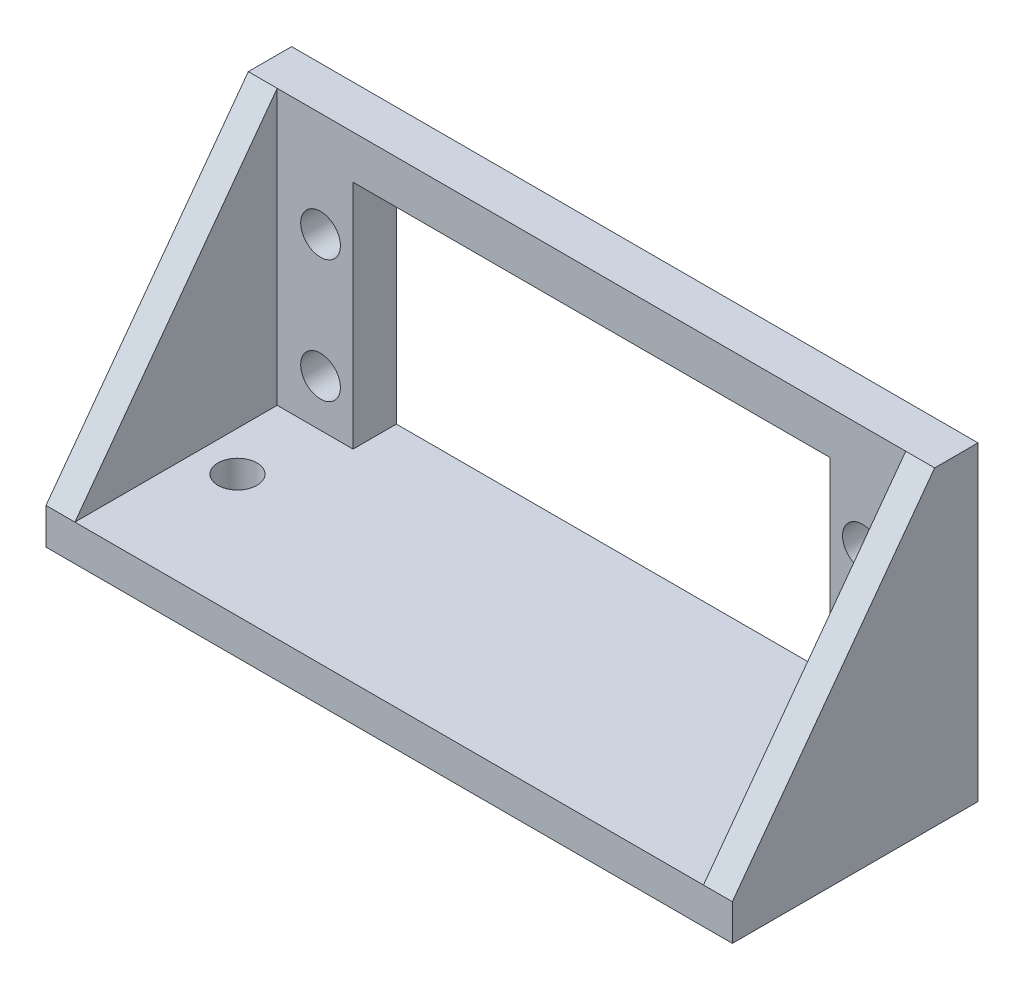
ISO-10303-21;
HEADER;
FILE_DESCRIPTION(('STEP AP214'),'2;1');
FILE_NAME('part.step','',(''),(''),'','','');
FILE_SCHEMA(('AUTOMOTIVE_DESIGN { 1 0 10303 214 1 1 1 1 }'));
ENDSEC;
DATA;
#1=APPLICATION_CONTEXT('core data for automotive mechanical design processes');
#2=APPLICATION_PROTOCOL_DEFINITION('international standard','automotive_design',2000,#1);
#3=PRODUCT_CONTEXT('',#1,'mechanical');
#4=PRODUCT('Part','Part','',(#3));
#5=PRODUCT_RELATED_PRODUCT_CATEGORY('part','',(#4));
#6=PRODUCT_DEFINITION_FORMATION('','',#4);
#7=PRODUCT_DEFINITION_CONTEXT('part definition',#1,'design');
#8=PRODUCT_DEFINITION('design','',#6,#7);
#9=PRODUCT_DEFINITION_SHAPE('','',#8);
#10=(LENGTH_UNIT() NAMED_UNIT(*) SI_UNIT(.MILLI.,.METRE.));
#11=(NAMED_UNIT(*) PLANE_ANGLE_UNIT() SI_UNIT($,.RADIAN.));
#12=(NAMED_UNIT(*) SI_UNIT($,.STERADIAN.) SOLID_ANGLE_UNIT());
#13=UNCERTAINTY_MEASURE_WITH_UNIT(LENGTH_MEASURE(1.E-05),#10,'distance_accuracy_value','');
#14=(GEOMETRIC_REPRESENTATION_CONTEXT(3) GLOBAL_UNCERTAINTY_ASSIGNED_CONTEXT((#13)) GLOBAL_UNIT_ASSIGNED_CONTEXT((#10,
#11,#12)) REPRESENTATION_CONTEXT('',''));
#15=CARTESIAN_POINT('',(0.,0.,0.));
#16=DIRECTION('',(0.,0.,1.));
#17=DIRECTION('',(1.,0.,0.));
#18=AXIS2_PLACEMENT_3D('',#15,#16,#17);
#19=CARTESIAN_POINT('',(-33.,43.,-17.));
#20=DIRECTION('',(-1.,0.,0.));
#21=DIRECTION('',(0.,0.,1.));
#22=AXIS2_PLACEMENT_3D('',#19,#20,#21);
#23=PLANE('',#22);
#24=DIRECTION('',(0.,0.,-1.));
#25=VECTOR('',#24,1.);
#26=CARTESIAN_POINT('',(-33.,37.,-17.));
#27=LINE('',#26,#25);
#28=CARTESIAN_POINT('',(-33.,37.,-11.));
#29=VERTEX_POINT('',#28);
#30=CARTESIAN_POINT('',(-33.,37.,-17.));
#31=VERTEX_POINT('',#30);
#32=EDGE_CURVE('E157',#29,#31,#27,.T.);
#33=ORIENTED_EDGE('',*,*,#32,.F.);
#34=DIRECTION('',(0.,-1.,0.));
#35=VECTOR('',#34,1.);
#36=CARTESIAN_POINT('',(-33.,43.,-11.));
#37=LINE('',#36,#35);
#38=CARTESIAN_POINT('',(-33.,5.,-11.));
#39=VERTEX_POINT('',#38);
#40=EDGE_CURVE('E174',#29,#39,#37,.T.);
#41=ORIENTED_EDGE('',*,*,#40,.T.);
#42=DIRECTION('',(0.,0.,-1.));
#43=VECTOR('',#42,1.);
#44=CARTESIAN_POINT('',(-33.,5.,-17.));
#45=LINE('',#44,#43);
#46=CARTESIAN_POINT('',(-33.,5.,-17.));
#47=VERTEX_POINT('',#46);
#48=EDGE_CURVE('E162',#39,#47,#45,.T.);
#49=ORIENTED_EDGE('',*,*,#48,.T.);
#50=DIRECTION('',(0.,-1.,0.));
#51=VECTOR('',#50,1.);
#52=CARTESIAN_POINT('',(-33.,43.,-17.));
#53=LINE('',#52,#51);
#54=EDGE_CURVE('E180',#31,#47,#53,.T.);
#55=ORIENTED_EDGE('',*,*,#54,.F.);
#56=EDGE_LOOP('',(#33,#41,#49,#55));
#57=FACE_BOUND('',#56,.T.);
#58=ADVANCED_FACE('F35',(#57),#23,.F.);
#59=CARTESIAN_POINT('',(33.,43.,-16.9999999999999));
#60=DIRECTION('',(1.,0.,0.));
#61=DIRECTION('',(0.,0.,-1.));
#62=AXIS2_PLACEMENT_3D('',#59,#60,#61);
#63=PLANE('',#62);
#64=DIRECTION('',(0.,0.,1.));
#65=VECTOR('',#64,1.);
#66=CARTESIAN_POINT('',(33.,37.,-16.9999999999999));
#67=LINE('',#66,#65);
#68=CARTESIAN_POINT('',(33.,37.,-17.));
#69=VERTEX_POINT('',#68);
#70=CARTESIAN_POINT('',(33.,37.,-11.));
#71=VERTEX_POINT('',#70);
#72=EDGE_CURVE('E249',#69,#71,#67,.T.);
#73=ORIENTED_EDGE('',*,*,#72,.F.);
#74=DIRECTION('',(0.,-1.,0.));
#75=VECTOR('',#74,1.);
#76=CARTESIAN_POINT('',(33.,43.,-16.9999999999999));
#77=LINE('',#76,#75);
#78=CARTESIAN_POINT('',(33.,5.,-16.9999999999999));
#79=VERTEX_POINT('',#78);
#80=EDGE_CURVE('E155',#69,#79,#77,.T.);
#81=ORIENTED_EDGE('',*,*,#80,.T.);
#82=DIRECTION('',(0.,0.,1.));
#83=VECTOR('',#82,1.);
#84=CARTESIAN_POINT('',(33.,5.,-16.9999999999999));
#85=LINE('',#84,#83);
#86=CARTESIAN_POINT('',(33.,5.,-10.9999999999999));
#87=VERTEX_POINT('',#86);
#88=EDGE_CURVE('E152',#79,#87,#85,.T.);
#89=ORIENTED_EDGE('',*,*,#88,.T.);
#90=DIRECTION('',(0.,-1.,0.));
#91=VECTOR('',#90,1.);
#92=CARTESIAN_POINT('',(33.,43.,-10.9999999999999));
#93=LINE('',#92,#91);
#94=EDGE_CURVE('E60',#71,#87,#93,.T.);
#95=ORIENTED_EDGE('',*,*,#94,.F.);
#96=EDGE_LOOP('',(#73,#81,#89,#95));
#97=FACE_BOUND('',#96,.T.);
#98=ADVANCED_FACE('F266',(#97),#63,.F.);
#99=CARTESIAN_POINT('',(0.,5.,0.));
#100=DIRECTION('',(0.,1.,0.));
#101=DIRECTION('',(0.,0.,1.));
#102=AXIS2_PLACEMENT_3D('',#99,#100,#101);
#103=PLANE('',#102);
#104=DIRECTION('',(0.,0.,1.));
#105=VECTOR('',#104,1.);
#106=CARTESIAN_POINT('',(43.5,5.,-11.));
#107=LINE('',#106,#105);
#108=CARTESIAN_POINT('',(43.5,5.,-11.));
#109=VERTEX_POINT('',#108);
#110=CARTESIAN_POINT('',(43.5,5.,17.));
#111=VERTEX_POINT('',#110);
#112=EDGE_CURVE('E131',#109,#111,#107,.T.);
#113=ORIENTED_EDGE('',*,*,#112,.F.);
#114=DIRECTION('',(1.,0.,0.));
#115=VECTOR('',#114,1.);
#116=CARTESIAN_POINT('',(33.,5.,-10.9999999999999));
#117=LINE('',#116,#115);
#118=EDGE_CURVE('E143',#87,#109,#117,.T.);
#119=ORIENTED_EDGE('',*,*,#118,.F.);
#120=ORIENTED_EDGE('',*,*,#88,.F.);
#121=DIRECTION('',(-1.,0.,0.));
#122=VECTOR('',#121,1.);
#123=CARTESIAN_POINT('',(-47.5,5.,-17.));
#124=LINE('',#123,#122);
#125=EDGE_CURVE('E183',#79,#47,#124,.T.);
#126=ORIENTED_EDGE('',*,*,#125,.T.);
#127=ORIENTED_EDGE('',*,*,#48,.F.);
#128=DIRECTION('',(1.,0.,0.));
#129=VECTOR('',#128,1.);
#130=CARTESIAN_POINT('',(-33.,5.,-11.));
#131=LINE('',#130,#129);
#132=CARTESIAN_POINT('',(-43.5,5.,-11.));
#133=VERTEX_POINT('',#132);
#134=EDGE_CURVE('E167',#133,#39,#131,.T.);
#135=ORIENTED_EDGE('',*,*,#134,.F.);
#136=DIRECTION('',(0.,0.,1.));
#137=VECTOR('',#136,1.);
#138=CARTESIAN_POINT('',(-43.5,5.,-11.));
#139=LINE('',#138,#137);
#140=CARTESIAN_POINT('',(-43.5,5.,17.));
#141=VERTEX_POINT('',#140);
#142=EDGE_CURVE('E268',#133,#141,#139,.T.);
#143=ORIENTED_EDGE('',*,*,#142,.T.);
#144=DIRECTION('',(1.,0.,0.));
#145=VECTOR('',#144,1.);
#146=CARTESIAN_POINT('',(-47.5,5.,17.));
#147=LINE('',#146,#145);
#148=EDGE_CURVE('E147',#141,#111,#147,.T.);
#149=ORIENTED_EDGE('',*,*,#148,.T.);
#150=EDGE_LOOP('',(#113,#119,#120,#126,#127,#135,#143,#149));
#151=FACE_BOUND('',#150,.T.);
#152=CARTESIAN_POINT('',(-38.,5.,0.));
#153=DIRECTION('',(0.,1.,0.));
#154=DIRECTION('',(0.,0.,1.));
#155=AXIS2_PLACEMENT_3D('',#152,#153,#154);
#156=CIRCLE('',#155,2.7);
#157=CARTESIAN_POINT('',(-38.,5.,2.7));
#158=VERTEX_POINT('',#157);
#159=EDGE_CURVE('E205',#158,#158,#156,.T.);
#160=ORIENTED_EDGE('',*,*,#159,.F.);
#161=EDGE_LOOP('',(#160));
#162=FACE_BOUND('',#161,.T.);
#163=CARTESIAN_POINT('',(38.,5.,0.));
#164=DIRECTION('',(0.,1.,0.));
#165=DIRECTION('',(0.,0.,-1.));
#166=AXIS2_PLACEMENT_3D('',#163,#164,#165);
#167=CIRCLE('',#166,2.7);
#168=CARTESIAN_POINT('',(38.,5.,-2.7));
#169=VERTEX_POINT('',#168);
#170=EDGE_CURVE('E211',#169,#169,#167,.T.);
#171=ORIENTED_EDGE('',*,*,#170,.F.);
#172=EDGE_LOOP('',(#171));
#173=FACE_BOUND('',#172,.T.);
#174=ADVANCED_FACE('F140',(#151,#162,#173),#103,.T.);
#175=CARTESIAN_POINT('',(47.5,5.,-17.));
#176=DIRECTION('',(-1.,0.,0.));
#177=DIRECTION('',(0.,0.,1.));
#178=AXIS2_PLACEMENT_3D('',#175,#176,#177);
#179=PLANE('',#178);
#180=DIRECTION('',(0.,0.,-1.));
#181=VECTOR('',#180,1.);
#182=CARTESIAN_POINT('',(47.5,43.,-17.));
#183=LINE('',#182,#181);
#184=CARTESIAN_POINT('',(47.5,43.,-11.));
#185=VERTEX_POINT('',#184);
#186=CARTESIAN_POINT('',(47.5,43.,-17.));
#187=VERTEX_POINT('',#186);
#188=EDGE_CURVE('E151',#185,#187,#183,.T.);
#189=ORIENTED_EDGE('',*,*,#188,.F.);
#190=DIRECTION('',(0.,0.805055837353368,-0.59319903804985));
#191=VECTOR('',#190,1.);
#192=CARTESIAN_POINT('',(47.5,5.,17.));
#193=LINE('',#192,#191);
#194=CARTESIAN_POINT('',(47.5,5.,17.));
#195=VERTEX_POINT('',#194);
#196=EDGE_CURVE('E148',#195,#185,#193,.T.);
#197=ORIENTED_EDGE('',*,*,#196,.F.);
#198=DIRECTION('',(0.,-1.,0.));
#199=VECTOR('',#198,1.);
#200=CARTESIAN_POINT('',(47.5,5.,17.));
#201=LINE('',#200,#199);
#202=CARTESIAN_POINT('',(47.5,0.,17.));
#203=VERTEX_POINT('',#202);
#204=EDGE_CURVE('E189',#195,#203,#201,.T.);
#205=ORIENTED_EDGE('',*,*,#204,.T.);
#206=DIRECTION('',(0.,0.,-1.));
#207=VECTOR('',#206,1.);
#208=CARTESIAN_POINT('',(47.5,0.,-17.));
#209=LINE('',#208,#207);
#210=CARTESIAN_POINT('',(47.5,0.,-17.));
#211=VERTEX_POINT('',#210);
#212=EDGE_CURVE('E182',#203,#211,#209,.T.);
#213=ORIENTED_EDGE('',*,*,#212,.T.);
#214=DIRECTION('',(0.,-1.,0.));
#215=VECTOR('',#214,1.);
#216=CARTESIAN_POINT('',(47.5,5.,-17.));
#217=LINE('',#216,#215);
#218=EDGE_CURVE('E11',#187,#211,#217,.T.);
#219=ORIENTED_EDGE('',*,*,#218,.F.);
#220=EDGE_LOOP('',(#189,#197,#205,#213,#219));
#221=FACE_BOUND('',#220,.T.);
#222=ADVANCED_FACE('F37',(#221),#179,.F.);
#223=CARTESIAN_POINT('',(-47.5,5.,-17.));
#224=DIRECTION('',(0.,0.,1.));
#225=DIRECTION('',(1.,0.,0.));
#226=AXIS2_PLACEMENT_3D('',#223,#224,#225);
#227=PLANE('',#226);
#228=CARTESIAN_POINT('',(37.5,11.5,-17.));
#229=DIRECTION('',(0.,0.,-1.));
#230=DIRECTION('',(1.,0.,0.));
#231=AXIS2_PLACEMENT_3D('',#228,#229,#230);
#232=CIRCLE('',#231,2.75);
#233=CARTESIAN_POINT('',(40.25,11.5,-17.));
#234=VERTEX_POINT('',#233);
#235=EDGE_CURVE('E209',#234,#234,#232,.T.);
#236=ORIENTED_EDGE('',*,*,#235,.F.);
#237=EDGE_LOOP('',(#236));
#238=FACE_BOUND('',#237,.T.);
#239=CARTESIAN_POINT('',(37.5,28.5,-17.));
#240=DIRECTION('',(0.,0.,-1.));
#241=DIRECTION('',(1.,0.,0.));
#242=AXIS2_PLACEMENT_3D('',#239,#240,#241);
#243=CIRCLE('',#242,2.75);
#244=CARTESIAN_POINT('',(40.25,28.5,-17.));
#245=VERTEX_POINT('',#244);
#246=EDGE_CURVE('E231',#245,#245,#243,.T.);
#247=ORIENTED_EDGE('',*,*,#246,.F.);
#248=EDGE_LOOP('',(#247));
#249=FACE_BOUND('',#248,.T.);
#250=CARTESIAN_POINT('',(-37.5,28.5,-17.));
#251=DIRECTION('',(0.,0.,-1.));
#252=DIRECTION('',(-1.,0.,0.));
#253=AXIS2_PLACEMENT_3D('',#250,#251,#252);
#254=CIRCLE('',#253,2.75);
#255=CARTESIAN_POINT('',(-40.25,28.5,-17.));
#256=VERTEX_POINT('',#255);
#257=EDGE_CURVE('E225',#256,#256,#254,.T.);
#258=ORIENTED_EDGE('',*,*,#257,.F.);
#259=EDGE_LOOP('',(#258));
#260=FACE_BOUND('',#259,.T.);
#261=CARTESIAN_POINT('',(-37.5,11.5,-17.));
#262=DIRECTION('',(0.,0.,-1.));
#263=DIRECTION('',(-1.,0.,0.));
#264=AXIS2_PLACEMENT_3D('',#261,#262,#263);
#265=CIRCLE('',#264,2.75);
#266=CARTESIAN_POINT('',(-40.25,11.5,-17.));
#267=VERTEX_POINT('',#266);
#268=EDGE_CURVE('E224',#267,#267,#265,.T.);
#269=ORIENTED_EDGE('',*,*,#268,.F.);
#270=EDGE_LOOP('',(#269));
#271=FACE_BOUND('',#270,.T.);
#272=ORIENTED_EDGE('',*,*,#80,.F.);
#273=DIRECTION('',(-1.,0.,0.));
#274=VECTOR('',#273,1.);
#275=CARTESIAN_POINT('',(-47.5,37.,-17.));
#276=LINE('',#275,#274);
#277=EDGE_CURVE('E246',#69,#31,#276,.T.);
#278=ORIENTED_EDGE('',*,*,#277,.T.);
#279=ORIENTED_EDGE('',*,*,#54,.T.);
#280=ORIENTED_EDGE('',*,*,#125,.F.);
#281=EDGE_LOOP('',(#272,#278,#279,#280));
#282=FACE_BOUND('',#281,.T.);
#283=DIRECTION('',(-1.,0.,0.));
#284=VECTOR('',#283,1.);
#285=CARTESIAN_POINT('',(-33.,43.,-17.));
#286=LINE('',#285,#284);
#287=CARTESIAN_POINT('',(-47.5,43.,-17.));
#288=VERTEX_POINT('',#287);
#289=EDGE_CURVE('E163',#187,#288,#286,.T.);
#290=ORIENTED_EDGE('',*,*,#289,.F.);
#291=ORIENTED_EDGE('',*,*,#218,.T.);
#292=DIRECTION('',(-1.,0.,0.));
#293=VECTOR('',#292,1.);
#294=CARTESIAN_POINT('',(-47.5,0.,-17.));
#295=LINE('',#294,#293);
#296=CARTESIAN_POINT('',(-47.5,0.,-17.));
#297=VERTEX_POINT('',#296);
#298=EDGE_CURVE('E192',#211,#297,#295,.T.);
#299=ORIENTED_EDGE('',*,*,#298,.T.);
#300=DIRECTION('',(0.,-1.,0.));
#301=VECTOR('',#300,1.);
#302=CARTESIAN_POINT('',(-47.5,5.,-17.));
#303=LINE('',#302,#301);
#304=EDGE_CURVE('E44',#288,#297,#303,.T.);
#305=ORIENTED_EDGE('',*,*,#304,.F.);
#306=EDGE_LOOP('',(#290,#291,#299,#305));
#307=FACE_BOUND('',#306,.T.);
#308=ADVANCED_FACE('F260',(#238,#249,#260,#271,#282,#307),#227,.F.);
#309=CARTESIAN_POINT('',(-47.5,5.,-17.));
#310=DIRECTION('',(1.,0.,0.));
#311=DIRECTION('',(0.,0.,-1.));
#312=AXIS2_PLACEMENT_3D('',#309,#310,#311);
#313=PLANE('',#312);
#314=DIRECTION('',(0.,-1.,0.));
#315=VECTOR('',#314,1.);
#316=CARTESIAN_POINT('',(-47.5,5.,17.));
#317=LINE('',#316,#315);
#318=CARTESIAN_POINT('',(-47.5,5.,17.));
#319=VERTEX_POINT('',#318);
#320=CARTESIAN_POINT('',(-47.5,0.,17.));
#321=VERTEX_POINT('',#320);
#322=EDGE_CURVE('E200',#319,#321,#317,.T.);
#323=ORIENTED_EDGE('',*,*,#322,.F.);
#324=DIRECTION('',(0.,0.805055837353368,-0.59319903804985));
#325=VECTOR('',#324,1.);
#326=CARTESIAN_POINT('',(-47.5,5.,17.));
#327=LINE('',#326,#325);
#328=CARTESIAN_POINT('',(-47.5,43.,-11.));
#329=VERTEX_POINT('',#328);
#330=EDGE_CURVE('E218',#319,#329,#327,.T.);
#331=ORIENTED_EDGE('',*,*,#330,.T.);
#332=DIRECTION('',(0.,0.,1.));
#333=VECTOR('',#332,1.);
#334=CARTESIAN_POINT('',(-47.5,43.,-17.));
#335=LINE('',#334,#333);
#336=EDGE_CURVE('E166',#288,#329,#335,.T.);
#337=ORIENTED_EDGE('',*,*,#336,.F.);
#338=ORIENTED_EDGE('',*,*,#304,.T.);
#339=DIRECTION('',(0.,0.,1.));
#340=VECTOR('',#339,1.);
#341=CARTESIAN_POINT('',(-47.5,0.,-17.));
#342=LINE('',#341,#340);
#343=EDGE_CURVE('E195',#297,#321,#342,.T.);
#344=ORIENTED_EDGE('',*,*,#343,.T.);
#345=EDGE_LOOP('',(#323,#331,#337,#338,#344));
#346=FACE_BOUND('',#345,.T.);
#347=ADVANCED_FACE('F295',(#346),#313,.F.);
#348=CARTESIAN_POINT('',(-47.5,5.,17.));
#349=DIRECTION('',(0.,0.,-1.));
#350=DIRECTION('',(-1.,0.,0.));
#351=AXIS2_PLACEMENT_3D('',#348,#349,#350);
#352=PLANE('',#351);
#353=DIRECTION('',(1.,0.,0.));
#354=VECTOR('',#353,1.);
#355=CARTESIAN_POINT('',(-47.5,0.,17.));
#356=LINE('',#355,#354);
#357=EDGE_CURVE('E186',#321,#203,#356,.T.);
#358=ORIENTED_EDGE('',*,*,#357,.T.);
#359=ORIENTED_EDGE('',*,*,#204,.F.);
#360=DIRECTION('',(1.,0.,0.));
#361=VECTOR('',#360,1.);
#362=CARTESIAN_POINT('',(43.5,5.,17.));
#363=LINE('',#362,#361);
#364=EDGE_CURVE('E275',#111,#195,#363,.T.);
#365=ORIENTED_EDGE('',*,*,#364,.F.);
#366=ORIENTED_EDGE('',*,*,#148,.F.);
#367=EDGE_CURVE('E187',#319,#141,#147,.T.);
#368=ORIENTED_EDGE('',*,*,#367,.F.);
#369=ORIENTED_EDGE('',*,*,#322,.T.);
#370=EDGE_LOOP('',(#358,#359,#365,#366,#368,#369));
#371=FACE_BOUND('',#370,.T.);
#372=ADVANCED_FACE('F300',(#371),#352,.F.);
#373=CARTESIAN_POINT('',(0.,0.,0.));
#374=DIRECTION('',(0.,1.,0.));
#375=DIRECTION('',(0.,0.,1.));
#376=AXIS2_PLACEMENT_3D('',#373,#374,#375);
#377=PLANE('',#376);
#378=CARTESIAN_POINT('',(-38.,0.,0.));
#379=DIRECTION('',(0.,1.,0.));
#380=DIRECTION('',(0.,0.,1.));
#381=AXIS2_PLACEMENT_3D('',#378,#379,#380);
#382=CIRCLE('',#381,2.7);
#383=CARTESIAN_POINT('',(-38.,0.,2.7));
#384=VERTEX_POINT('',#383);
#385=EDGE_CURVE('E39',#384,#384,#382,.T.);
#386=ORIENTED_EDGE('',*,*,#385,.T.);
#387=EDGE_LOOP('',(#386));
#388=FACE_BOUND('',#387,.T.);
#389=CARTESIAN_POINT('',(38.,0.,0.));
#390=DIRECTION('',(0.,1.,0.));
#391=DIRECTION('',(0.,0.,1.));
#392=AXIS2_PLACEMENT_3D('',#389,#390,#391);
#393=CIRCLE('',#392,2.7);
#394=CARTESIAN_POINT('',(38.,0.,2.69999999999999));
#395=VERTEX_POINT('',#394);
#396=EDGE_CURVE('E203',#395,#395,#393,.T.);
#397=ORIENTED_EDGE('',*,*,#396,.T.);
#398=EDGE_LOOP('',(#397));
#399=FACE_BOUND('',#398,.T.);
#400=ORIENTED_EDGE('',*,*,#212,.F.);
#401=ORIENTED_EDGE('',*,*,#357,.F.);
#402=ORIENTED_EDGE('',*,*,#343,.F.);
#403=ORIENTED_EDGE('',*,*,#298,.F.);
#404=EDGE_LOOP('',(#400,#401,#402,#403));
#405=FACE_BOUND('',#404,.T.);
#406=ADVANCED_FACE('F291',(#388,#399,#405),#377,.F.);
#407=CARTESIAN_POINT('',(-33.,43.,-11.));
#408=DIRECTION('',(0.,0.,-1.));
#409=DIRECTION('',(-1.,0.,0.));
#410=AXIS2_PLACEMENT_3D('',#407,#408,#409);
#411=PLANE('',#410);
#412=CARTESIAN_POINT('',(37.5,11.5,-11.));
#413=DIRECTION('',(0.,0.,-1.));
#414=DIRECTION('',(1.,0.,0.));
#415=AXIS2_PLACEMENT_3D('',#412,#413,#414);
#416=CIRCLE('',#415,2.75);
#417=CARTESIAN_POINT('',(40.25,11.5,-11.));
#418=VERTEX_POINT('',#417);
#419=EDGE_CURVE('E234',#418,#418,#416,.T.);
#420=ORIENTED_EDGE('',*,*,#419,.T.);
#421=EDGE_LOOP('',(#420));
#422=FACE_BOUND('',#421,.T.);
#423=CARTESIAN_POINT('',(37.5,28.5,-11.));
#424=DIRECTION('',(0.,0.,-1.));
#425=DIRECTION('',(1.,0.,0.));
#426=AXIS2_PLACEMENT_3D('',#423,#424,#425);
#427=CIRCLE('',#426,2.75);
#428=CARTESIAN_POINT('',(40.25,28.5,-11.));
#429=VERTEX_POINT('',#428);
#430=EDGE_CURVE('E228',#429,#429,#427,.T.);
#431=ORIENTED_EDGE('',*,*,#430,.T.);
#432=EDGE_LOOP('',(#431));
#433=FACE_BOUND('',#432,.T.);
#434=CARTESIAN_POINT('',(-37.5,28.5,-11.));
#435=DIRECTION('',(0.,0.,-1.));
#436=DIRECTION('',(-1.,0.,0.));
#437=AXIS2_PLACEMENT_3D('',#434,#435,#436);
#438=CIRCLE('',#437,2.75);
#439=CARTESIAN_POINT('',(-40.25,28.5,-11.));
#440=VERTEX_POINT('',#439);
#441=EDGE_CURVE('E221',#440,#440,#438,.T.);
#442=ORIENTED_EDGE('',*,*,#441,.T.);
#443=EDGE_LOOP('',(#442));
#444=FACE_BOUND('',#443,.T.);
#445=CARTESIAN_POINT('',(-37.5,11.5,-11.));
#446=DIRECTION('',(0.,0.,-1.));
#447=DIRECTION('',(-1.,0.,0.));
#448=AXIS2_PLACEMENT_3D('',#445,#446,#447);
#449=CIRCLE('',#448,2.75);
#450=CARTESIAN_POINT('',(-40.25,11.5,-11.));
#451=VERTEX_POINT('',#450);
#452=EDGE_CURVE('E239',#451,#451,#449,.T.);
#453=ORIENTED_EDGE('',*,*,#452,.T.);
#454=EDGE_LOOP('',(#453));
#455=FACE_BOUND('',#454,.T.);
#456=ORIENTED_EDGE('',*,*,#118,.T.);
#457=DIRECTION('',(0.,-1.,0.));
#458=VECTOR('',#457,1.);
#459=CARTESIAN_POINT('',(43.5,43.,-11.));
#460=LINE('',#459,#458);
#461=CARTESIAN_POINT('',(43.5,43.,-11.));
#462=VERTEX_POINT('',#461);
#463=EDGE_CURVE('E128',#462,#109,#460,.T.);
#464=ORIENTED_EDGE('',*,*,#463,.F.);
#465=DIRECTION('',(1.,0.,0.));
#466=VECTOR('',#465,1.);
#467=CARTESIAN_POINT('',(-33.,43.,-11.));
#468=LINE('',#467,#466);
#469=CARTESIAN_POINT('',(-43.5,43.,-11.));
#470=VERTEX_POINT('',#469);
#471=EDGE_CURVE('E170',#470,#462,#468,.T.);
#472=ORIENTED_EDGE('',*,*,#471,.F.);
#473=DIRECTION('',(0.,-1.,0.));
#474=VECTOR('',#473,1.);
#475=CARTESIAN_POINT('',(-43.5,43.,-11.));
#476=LINE('',#475,#474);
#477=EDGE_CURVE('E52',#470,#133,#476,.T.);
#478=ORIENTED_EDGE('',*,*,#477,.T.);
#479=ORIENTED_EDGE('',*,*,#134,.T.);
#480=ORIENTED_EDGE('',*,*,#40,.F.);
#481=DIRECTION('',(1.,0.,0.));
#482=VECTOR('',#481,1.);
#483=CARTESIAN_POINT('',(-47.5,37.,-11.));
#484=LINE('',#483,#482);
#485=EDGE_CURVE('E242',#29,#71,#484,.T.);
#486=ORIENTED_EDGE('',*,*,#485,.T.);
#487=ORIENTED_EDGE('',*,*,#94,.T.);
#488=EDGE_LOOP('',(#456,#464,#472,#478,#479,#480,#486,#487));
#489=FACE_BOUND('',#488,.T.);
#490=ADVANCED_FACE('F150',(#422,#433,#444,#455,#489),#411,.F.);
#491=CARTESIAN_POINT('',(0.,43.,0.));
#492=DIRECTION('',(0.,-1.,0.));
#493=DIRECTION('',(0.,0.,-1.));
#494=AXIS2_PLACEMENT_3D('',#491,#492,#493);
#495=PLANE('',#494);
#496=EDGE_CURVE('E171',#329,#470,#468,.T.);
#497=ORIENTED_EDGE('',*,*,#496,.T.);
#498=ORIENTED_EDGE('',*,*,#471,.T.);
#499=DIRECTION('',(1.,0.,0.));
#500=VECTOR('',#499,1.);
#501=CARTESIAN_POINT('',(43.5,43.,-11.));
#502=LINE('',#501,#500);
#503=EDGE_CURVE('E272',#462,#185,#502,.T.);
#504=ORIENTED_EDGE('',*,*,#503,.T.);
#505=ORIENTED_EDGE('',*,*,#188,.T.);
#506=ORIENTED_EDGE('',*,*,#289,.T.);
#507=ORIENTED_EDGE('',*,*,#336,.T.);
#508=EDGE_LOOP('',(#497,#498,#504,#505,#506,#507));
#509=FACE_BOUND('',#508,.T.);
#510=ADVANCED_FACE('F285',(#509),#495,.F.);
#511=CARTESIAN_POINT('',(0.,37.,0.));
#512=DIRECTION('',(0.,1.,0.));
#513=DIRECTION('',(0.,0.,1.));
#514=AXIS2_PLACEMENT_3D('',#511,#512,#513);
#515=PLANE('',#514);
#516=ORIENTED_EDGE('',*,*,#485,.F.);
#517=ORIENTED_EDGE('',*,*,#32,.T.);
#518=ORIENTED_EDGE('',*,*,#277,.F.);
#519=ORIENTED_EDGE('',*,*,#72,.T.);
#520=EDGE_LOOP('',(#516,#517,#518,#519));
#521=FACE_BOUND('',#520,.T.);
#522=ADVANCED_FACE('F253',(#521),#515,.F.);
#523=CARTESIAN_POINT('',(-37.5,11.5,-11.));
#524=DIRECTION('',(0.,0.,-1.));
#525=DIRECTION('',(-1.,0.,0.));
#526=AXIS2_PLACEMENT_3D('',#523,#524,#525);
#527=CYLINDRICAL_SURFACE('',#526,2.75);
#528=ORIENTED_EDGE('',*,*,#452,.F.);
#529=EDGE_LOOP('',(#528));
#530=FACE_BOUND('',#529,.T.);
#531=ORIENTED_EDGE('',*,*,#268,.T.);
#532=EDGE_LOOP('',(#531));
#533=FACE_BOUND('',#532,.T.);
#534=ADVANCED_FACE('F343',(#530,#533),#527,.F.);
#535=CARTESIAN_POINT('',(-37.5,28.5,-11.));
#536=DIRECTION('',(0.,0.,-1.));
#537=DIRECTION('',(-1.,0.,0.));
#538=AXIS2_PLACEMENT_3D('',#535,#536,#537);
#539=CYLINDRICAL_SURFACE('',#538,2.75);
#540=ORIENTED_EDGE('',*,*,#441,.F.);
#541=EDGE_LOOP('',(#540));
#542=FACE_BOUND('',#541,.T.);
#543=ORIENTED_EDGE('',*,*,#257,.T.);
#544=EDGE_LOOP('',(#543));
#545=FACE_BOUND('',#544,.T.);
#546=ADVANCED_FACE('F345',(#542,#545),#539,.F.);
#547=CARTESIAN_POINT('',(37.5,28.5,-11.));
#548=DIRECTION('',(0.,0.,-1.));
#549=DIRECTION('',(-1.,0.,0.));
#550=AXIS2_PLACEMENT_3D('',#547,#548,#549);
#551=CYLINDRICAL_SURFACE('',#550,2.75);
#552=ORIENTED_EDGE('',*,*,#430,.F.);
#553=EDGE_LOOP('',(#552));
#554=FACE_BOUND('',#553,.T.);
#555=ORIENTED_EDGE('',*,*,#246,.T.);
#556=EDGE_LOOP('',(#555));
#557=FACE_BOUND('',#556,.T.);
#558=ADVANCED_FACE('F352',(#554,#557),#551,.F.);
#559=CARTESIAN_POINT('',(37.5,11.5,-11.));
#560=DIRECTION('',(0.,0.,-1.));
#561=DIRECTION('',(-1.,0.,0.));
#562=AXIS2_PLACEMENT_3D('',#559,#560,#561);
#563=CYLINDRICAL_SURFACE('',#562,2.75);
#564=ORIENTED_EDGE('',*,*,#419,.F.);
#565=EDGE_LOOP('',(#564));
#566=FACE_BOUND('',#565,.T.);
#567=ORIENTED_EDGE('',*,*,#235,.T.);
#568=EDGE_LOOP('',(#567));
#569=FACE_BOUND('',#568,.T.);
#570=ADVANCED_FACE('F358',(#566,#569),#563,.F.);
#571=CARTESIAN_POINT('',(38.,-1.,0.));
#572=DIRECTION('',(0.,1.,0.));
#573=DIRECTION('',(0.,0.,1.));
#574=AXIS2_PLACEMENT_3D('',#571,#572,#573);
#575=CYLINDRICAL_SURFACE('',#574,2.7);
#576=ORIENTED_EDGE('',*,*,#170,.T.);
#577=EDGE_LOOP('',(#576));
#578=FACE_BOUND('',#577,.T.);
#579=ORIENTED_EDGE('',*,*,#396,.F.);
#580=EDGE_LOOP('',(#579));
#581=FACE_BOUND('',#580,.T.);
#582=ADVANCED_FACE('F380',(#578,#581),#575,.F.);
#583=CARTESIAN_POINT('',(-38.,-1.,0.));
#584=DIRECTION('',(0.,1.,0.));
#585=DIRECTION('',(0.,0.,1.));
#586=AXIS2_PLACEMENT_3D('',#583,#584,#585);
#587=CYLINDRICAL_SURFACE('',#586,2.7);
#588=ORIENTED_EDGE('',*,*,#159,.T.);
#589=EDGE_LOOP('',(#588));
#590=FACE_BOUND('',#589,.T.);
#591=ORIENTED_EDGE('',*,*,#385,.F.);
#592=EDGE_LOOP('',(#591));
#593=FACE_BOUND('',#592,.T.);
#594=ADVANCED_FACE('F311',(#590,#593),#587,.F.);
#595=CARTESIAN_POINT('',(-43.5,5.,17.));
#596=DIRECTION('',(0.,0.59319903804985,0.805055837353368));
#597=DIRECTION('',(0.,-0.805055837353368,0.59319903804985));
#598=AXIS2_PLACEMENT_3D('',#595,#596,#597);
#599=PLANE('',#598);
#600=ORIENTED_EDGE('',*,*,#330,.F.);
#601=ORIENTED_EDGE('',*,*,#367,.T.);
#602=DIRECTION('',(0.,0.805055837353368,-0.59319903804985));
#603=VECTOR('',#602,1.);
#604=CARTESIAN_POINT('',(-43.5,5.,17.));
#605=LINE('',#604,#603);
#606=EDGE_CURVE('E267',#141,#470,#605,.T.);
#607=ORIENTED_EDGE('',*,*,#606,.T.);
#608=ORIENTED_EDGE('',*,*,#496,.F.);
#609=EDGE_LOOP('',(#600,#601,#607,#608));
#610=FACE_BOUND('',#609,.T.);
#611=ADVANCED_FACE('F302',(#610),#599,.T.);
#612=CARTESIAN_POINT('',(-43.5,0.,0.));
#613=DIRECTION('',(1.,0.,0.));
#614=DIRECTION('',(0.,0.,-1.));
#615=AXIS2_PLACEMENT_3D('',#612,#613,#614);
#616=PLANE('',#615);
#617=ORIENTED_EDGE('',*,*,#142,.F.);
#618=ORIENTED_EDGE('',*,*,#477,.F.);
#619=ORIENTED_EDGE('',*,*,#606,.F.);
#620=EDGE_LOOP('',(#617,#618,#619));
#621=FACE_BOUND('',#620,.T.);
#622=ADVANCED_FACE('F303',(#621),#616,.T.);
#623=CARTESIAN_POINT('',(43.5,5.,17.));
#624=DIRECTION('',(0.,-0.59319903804985,-0.805055837353368));
#625=DIRECTION('',(0.,0.805055837353368,-0.59319903804985));
#626=AXIS2_PLACEMENT_3D('',#623,#624,#625);
#627=PLANE('',#626);
#628=ORIENTED_EDGE('',*,*,#196,.T.);
#629=ORIENTED_EDGE('',*,*,#503,.F.);
#630=DIRECTION('',(0.,0.805055837353368,-0.59319903804985));
#631=VECTOR('',#630,1.);
#632=CARTESIAN_POINT('',(43.5,5.,17.));
#633=LINE('',#632,#631);
#634=EDGE_CURVE('E133',#111,#462,#633,.T.);
#635=ORIENTED_EDGE('',*,*,#634,.F.);
#636=ORIENTED_EDGE('',*,*,#364,.T.);
#637=EDGE_LOOP('',(#628,#629,#635,#636));
#638=FACE_BOUND('',#637,.T.);
#639=ADVANCED_FACE('F280',(#638),#627,.F.);
#640=CARTESIAN_POINT('',(43.5,0.,0.));
#641=DIRECTION('',(-1.,0.,0.));
#642=DIRECTION('',(0.,0.,-1.));
#643=AXIS2_PLACEMENT_3D('',#640,#641,#642);
#644=PLANE('',#643);
#645=ORIENTED_EDGE('',*,*,#112,.T.);
#646=ORIENTED_EDGE('',*,*,#634,.T.);
#647=ORIENTED_EDGE('',*,*,#463,.T.);
#648=EDGE_LOOP('',(#645,#646,#647));
#649=FACE_BOUND('',#648,.T.);
#650=ADVANCED_FACE('F130',(#649),#644,.T.);
#651=CLOSED_SHELL('',(#58,#98,#174,#222,#308,#347,#372,#406,#490,#510,#522,#534,#546,#558,#570,
#582,#594,#611,#622,#639,#650));
#652=MANIFOLD_SOLID_BREP('B2',#651);
#653=ADVANCED_BREP_SHAPE_REPRESENTATION('',(#18,#652),#14);
#654=SHAPE_DEFINITION_REPRESENTATION(#9,#653);
ENDSEC;
END-ISO-10303-21;
